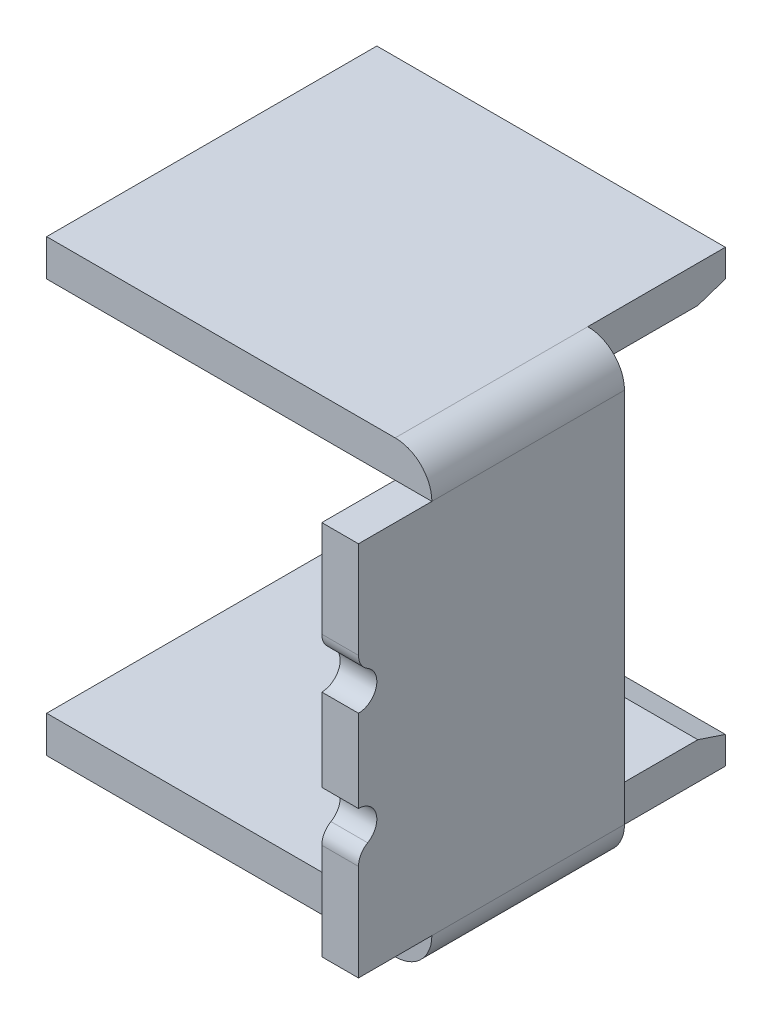
ISO-10303-21;
HEADER;
FILE_DESCRIPTION(('STEP AP214'),'2;1');
FILE_NAME('part.step','',(''),(''),'','','');
FILE_SCHEMA(('AUTOMOTIVE_DESIGN { 1 0 10303 214 1 1 1 1 }'));
ENDSEC;
DATA;
#1=APPLICATION_CONTEXT('core data for automotive mechanical design processes');
#2=APPLICATION_PROTOCOL_DEFINITION('international standard','automotive_design',2000,#1);
#3=PRODUCT_CONTEXT('',#1,'mechanical');
#4=PRODUCT('Part','Part','',(#3));
#5=PRODUCT_RELATED_PRODUCT_CATEGORY('part','',(#4));
#6=PRODUCT_DEFINITION_FORMATION('','',#4);
#7=PRODUCT_DEFINITION_CONTEXT('part definition',#1,'design');
#8=PRODUCT_DEFINITION('design','',#6,#7);
#9=PRODUCT_DEFINITION_SHAPE('','',#8);
#10=(LENGTH_UNIT() NAMED_UNIT(*) SI_UNIT(.MILLI.,.METRE.));
#11=(NAMED_UNIT(*) PLANE_ANGLE_UNIT() SI_UNIT($,.RADIAN.));
#12=(NAMED_UNIT(*) SI_UNIT($,.STERADIAN.) SOLID_ANGLE_UNIT());
#13=UNCERTAINTY_MEASURE_WITH_UNIT(LENGTH_MEASURE(1.E-05),#10,'distance_accuracy_value','');
#14=(GEOMETRIC_REPRESENTATION_CONTEXT(3) GLOBAL_UNCERTAINTY_ASSIGNED_CONTEXT((#13)) GLOBAL_UNIT_ASSIGNED_CONTEXT((#10,
#11,#12)) REPRESENTATION_CONTEXT('',''));
#15=CARTESIAN_POINT('',(0.,0.,0.));
#16=DIRECTION('',(0.,0.,1.));
#17=DIRECTION('',(1.,0.,0.));
#18=AXIS2_PLACEMENT_3D('',#15,#16,#17);
#19=CARTESIAN_POINT('',(2.1,0.2,0.15));
#20=DIRECTION('',(0.,0.948683298050514,-0.316227766016838));
#21=DIRECTION('',(-1.,0.,0.));
#22=AXIS2_PLACEMENT_3D('',#19,#20,#21);
#23=PLANE('',#22);
#24=DIRECTION('',(-1.,0.,0.));
#25=VECTOR('',#24,1.);
#26=CARTESIAN_POINT('',(2.1,0.15,0.));
#27=LINE('',#26,#25);
#28=CARTESIAN_POINT('',(1.9,0.15,0.));
#29=VERTEX_POINT('',#28);
#30=CARTESIAN_POINT('',(0.,0.15,0.));
#31=VERTEX_POINT('',#30);
#32=EDGE_CURVE('E424',#29,#31,#27,.T.);
#33=ORIENTED_EDGE('',*,*,#32,.T.);
#34=DIRECTION('',(0.,-0.316227766016838,-0.948683298050514));
#35=VECTOR('',#34,1.);
#36=CARTESIAN_POINT('',(0.,0.2,0.15));
#37=LINE('',#36,#35);
#38=CARTESIAN_POINT('',(0.,0.2,0.15));
#39=VERTEX_POINT('',#38);
#40=EDGE_CURVE('E21',#39,#31,#37,.T.);
#41=ORIENTED_EDGE('',*,*,#40,.F.);
#42=DIRECTION('',(-1.,0.,0.));
#43=VECTOR('',#42,1.);
#44=CARTESIAN_POINT('',(2.1,0.2,0.15));
#45=LINE('',#44,#43);
#46=CARTESIAN_POINT('',(1.9,0.2,0.15));
#47=VERTEX_POINT('',#46);
#48=EDGE_CURVE('E285',#47,#39,#45,.T.);
#49=ORIENTED_EDGE('',*,*,#48,.F.);
#50=DIRECTION('',(0.,0.316227766016838,0.948683298050514));
#51=VECTOR('',#50,1.);
#52=CARTESIAN_POINT('',(1.9,0.38,0.69));
#53=LINE('',#52,#51);
#54=EDGE_CURVE('E290',#29,#47,#53,.T.);
#55=ORIENTED_EDGE('',*,*,#54,.F.);
#56=EDGE_LOOP('',(#33,#41,#49,#55));
#57=FACE_BOUND('',#56,.T.);
#58=ADVANCED_FACE('F17',(#57),#23,.T.);
#59=CARTESIAN_POINT('',(2.1,2.3,0.));
#60=DIRECTION('',(0.,-0.948683298050514,-0.316227766016838));
#61=DIRECTION('',(0.,0.316227766016838,-0.948683298050514));
#62=AXIS2_PLACEMENT_3D('',#59,#60,#61);
#63=PLANE('',#62);
#64=DIRECTION('',(-1.,0.,0.));
#65=VECTOR('',#64,1.);
#66=CARTESIAN_POINT('',(2.1,2.25,0.15));
#67=LINE('',#66,#65);
#68=CARTESIAN_POINT('',(1.9,2.25,0.15));
#69=VERTEX_POINT('',#68);
#70=CARTESIAN_POINT('',(0.,2.25,0.15));
#71=VERTEX_POINT('',#70);
#72=EDGE_CURVE('E259',#69,#71,#67,.T.);
#73=ORIENTED_EDGE('',*,*,#72,.T.);
#74=DIRECTION('',(0.,-0.316227766016838,0.948683298050514));
#75=VECTOR('',#74,1.);
#76=CARTESIAN_POINT('',(0.,2.3,0.));
#77=LINE('',#76,#75);
#78=CARTESIAN_POINT('',(0.,2.3,0.));
#79=VERTEX_POINT('',#78);
#80=EDGE_CURVE('E246',#79,#71,#77,.T.);
#81=ORIENTED_EDGE('',*,*,#80,.F.);
#82=DIRECTION('',(-1.,0.,0.));
#83=VECTOR('',#82,1.);
#84=CARTESIAN_POINT('',(2.1,2.3,0.));
#85=LINE('',#84,#83);
#86=CARTESIAN_POINT('',(1.9,2.3,0.));
#87=VERTEX_POINT('',#86);
#88=EDGE_CURVE('E307',#87,#79,#85,.T.);
#89=ORIENTED_EDGE('',*,*,#88,.F.);
#90=DIRECTION('',(0.,0.316227766016838,-0.948683298050514));
#91=VECTOR('',#90,1.);
#92=CARTESIAN_POINT('',(1.9,2.315,-0.045));
#93=LINE('',#92,#91);
#94=EDGE_CURVE('E233',#69,#87,#93,.T.);
#95=ORIENTED_EDGE('',*,*,#94,.F.);
#96=EDGE_LOOP('',(#73,#81,#89,#95));
#97=FACE_BOUND('',#96,.T.);
#98=ADVANCED_FACE('F507',(#97),#63,.T.);
#99=CARTESIAN_POINT('',(1.9,2.25,1.8));
#100=DIRECTION('',(0.,1.,0.));
#101=DIRECTION('',(1.,0.,0.));
#102=AXIS2_PLACEMENT_3D('',#99,#100,#101);
#103=PLANE('',#102);
#104=DIRECTION('',(0.,0.,1.));
#105=VECTOR('',#104,1.);
#106=CARTESIAN_POINT('',(2.1,2.25,1.8));
#107=LINE('',#106,#105);
#108=CARTESIAN_POINT('',(2.1,2.25,1.8));
#109=VERTEX_POINT('',#108);
#110=CARTESIAN_POINT('',(2.1,2.25,2.2));
#111=VERTEX_POINT('',#110);
#112=EDGE_CURVE('E298',#109,#111,#107,.T.);
#113=ORIENTED_EDGE('',*,*,#112,.F.);
#114=DIRECTION('',(1.,0.,0.));
#115=VECTOR('',#114,1.);
#116=CARTESIAN_POINT('',(1.9,2.25,1.8));
#117=LINE('',#116,#115);
#118=CARTESIAN_POINT('',(1.9,2.25,1.8));
#119=VERTEX_POINT('',#118);
#120=EDGE_CURVE('E191',#119,#109,#117,.T.);
#121=ORIENTED_EDGE('',*,*,#120,.F.);
#122=DIRECTION('',(0.,0.,1.));
#123=VECTOR('',#122,1.);
#124=CARTESIAN_POINT('',(1.9,2.25,1.8));
#125=LINE('',#124,#123);
#126=CARTESIAN_POINT('',(1.9,2.25,2.2));
#127=VERTEX_POINT('',#126);
#128=EDGE_CURVE('E324',#119,#127,#125,.T.);
#129=ORIENTED_EDGE('',*,*,#128,.T.);
#130=DIRECTION('',(1.,0.,0.));
#131=VECTOR('',#130,1.);
#132=CARTESIAN_POINT('',(1.9,2.25,2.2));
#133=LINE('',#132,#131);
#134=EDGE_CURVE('E42',#127,#111,#133,.T.);
#135=ORIENTED_EDGE('',*,*,#134,.T.);
#136=EDGE_LOOP('',(#113,#121,#129,#135));
#137=FACE_BOUND('',#136,.T.);
#138=ADVANCED_FACE('F581',(#137),#103,.T.);
#139=CARTESIAN_POINT('',(1.9,0.2,2.2));
#140=DIRECTION('',(0.,-1.,0.));
#141=DIRECTION('',(0.,0.,-1.));
#142=AXIS2_PLACEMENT_3D('',#139,#140,#141);
#143=PLANE('',#142);
#144=DIRECTION('',(0.,0.,-1.));
#145=VECTOR('',#144,1.);
#146=CARTESIAN_POINT('',(2.1,0.2,2.2));
#147=LINE('',#146,#145);
#148=CARTESIAN_POINT('',(2.1,0.2,2.2));
#149=VERTEX_POINT('',#148);
#150=CARTESIAN_POINT('',(2.1,0.2,1.8));
#151=VERTEX_POINT('',#150);
#152=EDGE_CURVE('E268',#149,#151,#147,.T.);
#153=ORIENTED_EDGE('',*,*,#152,.F.);
#154=DIRECTION('',(1.,0.,0.));
#155=VECTOR('',#154,1.);
#156=CARTESIAN_POINT('',(1.9,0.2,2.2));
#157=LINE('',#156,#155);
#158=CARTESIAN_POINT('',(1.9,0.2,2.2));
#159=VERTEX_POINT('',#158);
#160=EDGE_CURVE('E11',#159,#149,#157,.T.);
#161=ORIENTED_EDGE('',*,*,#160,.F.);
#162=DIRECTION('',(0.,0.,-1.));
#163=VECTOR('',#162,1.);
#164=CARTESIAN_POINT('',(1.9,0.2,2.2));
#165=LINE('',#164,#163);
#166=CARTESIAN_POINT('',(1.9,0.2,1.8));
#167=VERTEX_POINT('',#166);
#168=EDGE_CURVE('E318',#159,#167,#165,.T.);
#169=ORIENTED_EDGE('',*,*,#168,.T.);
#170=DIRECTION('',(1.,0.,0.));
#171=VECTOR('',#170,1.);
#172=CARTESIAN_POINT('',(1.9,0.2,1.8));
#173=LINE('',#172,#171);
#174=EDGE_CURVE('E323',#167,#151,#173,.T.);
#175=ORIENTED_EDGE('',*,*,#174,.T.);
#176=EDGE_LOOP('',(#153,#161,#169,#175));
#177=FACE_BOUND('',#176,.T.);
#178=ADVANCED_FACE('F541',(#177),#143,.T.);
#179=CARTESIAN_POINT('',(1.9,0.726794919243,2.2));
#180=DIRECTION('',(0.,0.,1.));
#181=DIRECTION('',(1.,0.,0.));
#182=AXIS2_PLACEMENT_3D('',#179,#180,#181);
#183=PLANE('',#182);
#184=DIRECTION('',(0.,-1.,0.));
#185=VECTOR('',#184,1.);
#186=CARTESIAN_POINT('',(2.1,0.726794919243,2.2));
#187=LINE('',#186,#185);
#188=CARTESIAN_POINT('',(2.1,0.726794919243,2.2));
#189=VERTEX_POINT('',#188);
#190=EDGE_CURVE('E306',#189,#149,#187,.T.);
#191=ORIENTED_EDGE('',*,*,#190,.F.);
#192=DIRECTION('',(1.,0.,0.));
#193=VECTOR('',#192,1.);
#194=CARTESIAN_POINT('',(1.9,0.726794919243,2.2));
#195=LINE('',#194,#193);
#196=CARTESIAN_POINT('',(1.9,0.726794919243,2.2));
#197=VERTEX_POINT('',#196);
#198=EDGE_CURVE('E28',#197,#189,#195,.T.);
#199=ORIENTED_EDGE('',*,*,#198,.F.);
#200=DIRECTION('',(0.,-1.,0.));
#201=VECTOR('',#200,1.);
#202=CARTESIAN_POINT('',(1.9,0.726794919243,2.2));
#203=LINE('',#202,#201);
#204=EDGE_CURVE('E412',#197,#159,#203,.T.);
#205=ORIENTED_EDGE('',*,*,#204,.T.);
#206=ORIENTED_EDGE('',*,*,#160,.T.);
#207=EDGE_LOOP('',(#191,#199,#205,#206));
#208=FACE_BOUND('',#207,.T.);
#209=ADVANCED_FACE('F587',(#208),#183,.T.);
#210=CARTESIAN_POINT('',(1.9,0.726794919243,2.1));
#211=DIRECTION('',(1.,0.,0.));
#212=DIRECTION('',(0.,0.,-1.));
#213=AXIS2_PLACEMENT_3D('',#210,#211,#212);
#214=CYLINDRICAL_SURFACE('',#213,0.1);
#215=CARTESIAN_POINT('',(2.1,0.726794919243,2.1));
#216=DIRECTION('',(1.,0.,0.));
#217=DIRECTION('',(0.,0.,-1.));
#218=AXIS2_PLACEMENT_3D('',#215,#216,#217);
#219=CIRCLE('',#218,0.1);
#220=CARTESIAN_POINT('',(2.1,0.813397461903,2.149999996049));
#221=VERTEX_POINT('',#220);
#222=EDGE_CURVE('E228',#221,#189,#219,.T.);
#223=ORIENTED_EDGE('',*,*,#222,.F.);
#224=DIRECTION('',(1.,0.,0.));
#225=VECTOR('',#224,1.);
#226=CARTESIAN_POINT('',(1.9,0.813397461903,2.149999996049));
#227=LINE('',#226,#225);
#228=CARTESIAN_POINT('',(1.9,0.813397461903,2.149999996049));
#229=VERTEX_POINT('',#228);
#230=EDGE_CURVE('E240',#229,#221,#227,.T.);
#231=ORIENTED_EDGE('',*,*,#230,.F.);
#232=CARTESIAN_POINT('',(1.9,0.726794919243,2.1));
#233=DIRECTION('',(1.,0.,0.));
#234=DIRECTION('',(0.,0.,-1.));
#235=AXIS2_PLACEMENT_3D('',#232,#233,#234);
#236=CIRCLE('',#235,0.1);
#237=EDGE_CURVE('E370',#229,#197,#236,.T.);
#238=ORIENTED_EDGE('',*,*,#237,.T.);
#239=ORIENTED_EDGE('',*,*,#198,.T.);
#240=EDGE_LOOP('',(#223,#231,#238,#239));
#241=FACE_BOUND('',#240,.T.);
#242=ADVANCED_FACE('F601',(#241),#214,.T.);
#243=CARTESIAN_POINT('',(1.9,0.9,2.2));
#244=DIRECTION('',(1.,0.,0.));
#245=DIRECTION('',(0.,0.,-1.));
#246=AXIS2_PLACEMENT_3D('',#243,#244,#245);
#247=CYLINDRICAL_SURFACE('',#246,0.1);
#248=CARTESIAN_POINT('',(2.1,0.9,2.2));
#249=DIRECTION('',(1.,0.,0.));
#250=DIRECTION('',(0.,0.,-1.));
#251=AXIS2_PLACEMENT_3D('',#248,#249,#250);
#252=CIRCLE('',#251,0.1);
#253=CARTESIAN_POINT('',(2.1,1.,2.2));
#254=VERTEX_POINT('',#253);
#255=EDGE_CURVE('E218',#221,#254,#252,.T.);
#256=ORIENTED_EDGE('',*,*,#255,.T.);
#257=DIRECTION('',(1.,0.,0.));
#258=VECTOR('',#257,1.);
#259=CARTESIAN_POINT('',(1.9,1.,2.2));
#260=LINE('',#259,#258);
#261=CARTESIAN_POINT('',(1.9,1.,2.2));
#262=VERTEX_POINT('',#261);
#263=EDGE_CURVE('E237',#262,#254,#260,.T.);
#264=ORIENTED_EDGE('',*,*,#263,.F.);
#265=CARTESIAN_POINT('',(1.9,0.9,2.2));
#266=DIRECTION('',(1.,0.,0.));
#267=DIRECTION('',(0.,0.,-1.));
#268=AXIS2_PLACEMENT_3D('',#265,#266,#267);
#269=CIRCLE('',#268,0.1);
#270=EDGE_CURVE('E265',#229,#262,#269,.T.);
#271=ORIENTED_EDGE('',*,*,#270,.F.);
#272=ORIENTED_EDGE('',*,*,#230,.T.);
#273=EDGE_LOOP('',(#256,#264,#271,#272));
#274=FACE_BOUND('',#273,.T.);
#275=ADVANCED_FACE('F612',(#274),#247,.F.);
#276=CARTESIAN_POINT('',(1.9,1.45,2.2));
#277=DIRECTION('',(0.,0.,1.));
#278=DIRECTION('',(1.,0.,0.));
#279=AXIS2_PLACEMENT_3D('',#276,#277,#278);
#280=PLANE('',#279);
#281=DIRECTION('',(0.,-1.,0.));
#282=VECTOR('',#281,1.);
#283=CARTESIAN_POINT('',(2.1,1.45,2.2));
#284=LINE('',#283,#282);
#285=CARTESIAN_POINT('',(2.1,1.45,2.2));
#286=VERTEX_POINT('',#285);
#287=EDGE_CURVE('E210',#286,#254,#284,.T.);
#288=ORIENTED_EDGE('',*,*,#287,.F.);
#289=DIRECTION('',(1.,0.,0.));
#290=VECTOR('',#289,1.);
#291=CARTESIAN_POINT('',(1.9,1.45,2.2));
#292=LINE('',#291,#290);
#293=CARTESIAN_POINT('',(1.9,1.45,2.2));
#294=VERTEX_POINT('',#293);
#295=EDGE_CURVE('E241',#294,#286,#292,.T.);
#296=ORIENTED_EDGE('',*,*,#295,.F.);
#297=DIRECTION('',(0.,-1.,0.));
#298=VECTOR('',#297,1.);
#299=CARTESIAN_POINT('',(1.9,1.45,2.2));
#300=LINE('',#299,#298);
#301=EDGE_CURVE('E260',#294,#262,#300,.T.);
#302=ORIENTED_EDGE('',*,*,#301,.T.);
#303=ORIENTED_EDGE('',*,*,#263,.T.);
#304=EDGE_LOOP('',(#288,#296,#302,#303));
#305=FACE_BOUND('',#304,.T.);
#306=ADVANCED_FACE('F619',(#305),#280,.T.);
#307=CARTESIAN_POINT('',(1.9,1.55,2.2));
#308=DIRECTION('',(1.,0.,0.));
#309=DIRECTION('',(0.,0.,-1.));
#310=AXIS2_PLACEMENT_3D('',#307,#308,#309);
#311=CYLINDRICAL_SURFACE('',#310,0.1);
#312=CARTESIAN_POINT('',(2.1,1.55,2.2));
#313=DIRECTION('',(1.,0.,0.));
#314=DIRECTION('',(0.,0.,-1.));
#315=AXIS2_PLACEMENT_3D('',#312,#313,#314);
#316=CIRCLE('',#315,0.1);
#317=CARTESIAN_POINT('',(2.1,1.636602538097,2.149999996049));
#318=VERTEX_POINT('',#317);
#319=EDGE_CURVE('E206',#286,#318,#316,.T.);
#320=ORIENTED_EDGE('',*,*,#319,.T.);
#321=DIRECTION('',(1.,0.,0.));
#322=VECTOR('',#321,1.);
#323=CARTESIAN_POINT('',(1.9,1.636602538097,2.149999996049));
#324=LINE('',#323,#322);
#325=CARTESIAN_POINT('',(1.9,1.636602538097,2.149999996049));
#326=VERTEX_POINT('',#325);
#327=EDGE_CURVE('E250',#326,#318,#324,.T.);
#328=ORIENTED_EDGE('',*,*,#327,.F.);
#329=CARTESIAN_POINT('',(1.9,1.55,2.2));
#330=DIRECTION('',(1.,0.,0.));
#331=DIRECTION('',(0.,0.,-1.));
#332=AXIS2_PLACEMENT_3D('',#329,#330,#331);
#333=CIRCLE('',#332,0.1);
#334=EDGE_CURVE('E264',#294,#326,#333,.T.);
#335=ORIENTED_EDGE('',*,*,#334,.F.);
#336=ORIENTED_EDGE('',*,*,#295,.T.);
#337=EDGE_LOOP('',(#320,#328,#335,#336));
#338=FACE_BOUND('',#337,.T.);
#339=ADVANCED_FACE('F615',(#338),#311,.F.);
#340=CARTESIAN_POINT('',(1.9,1.723205080757,2.1));
#341=DIRECTION('',(1.,0.,0.));
#342=DIRECTION('',(0.,0.,-1.));
#343=AXIS2_PLACEMENT_3D('',#340,#341,#342);
#344=CYLINDRICAL_SURFACE('',#343,0.1);
#345=CARTESIAN_POINT('',(2.1,1.723205080757,2.1));
#346=DIRECTION('',(1.,0.,0.));
#347=DIRECTION('',(0.,0.,-1.));
#348=AXIS2_PLACEMENT_3D('',#345,#346,#347);
#349=CIRCLE('',#348,0.1);
#350=CARTESIAN_POINT('',(2.1,1.723205080757,2.2));
#351=VERTEX_POINT('',#350);
#352=EDGE_CURVE('E204',#351,#318,#349,.T.);
#353=ORIENTED_EDGE('',*,*,#352,.F.);
#354=DIRECTION('',(1.,0.,0.));
#355=VECTOR('',#354,1.);
#356=CARTESIAN_POINT('',(1.9,1.723205080757,2.2));
#357=LINE('',#356,#355);
#358=CARTESIAN_POINT('',(1.9,1.723205080757,2.2));
#359=VERTEX_POINT('',#358);
#360=EDGE_CURVE('E253',#359,#351,#357,.T.);
#361=ORIENTED_EDGE('',*,*,#360,.F.);
#362=CARTESIAN_POINT('',(1.9,1.723205080757,2.1));
#363=DIRECTION('',(1.,0.,0.));
#364=DIRECTION('',(0.,0.,-1.));
#365=AXIS2_PLACEMENT_3D('',#362,#363,#364);
#366=CIRCLE('',#365,0.1);
#367=EDGE_CURVE('E341',#359,#326,#366,.T.);
#368=ORIENTED_EDGE('',*,*,#367,.T.);
#369=ORIENTED_EDGE('',*,*,#327,.T.);
#370=EDGE_LOOP('',(#353,#361,#368,#369));
#371=FACE_BOUND('',#370,.T.);
#372=ADVANCED_FACE('F618',(#371),#344,.T.);
#373=CARTESIAN_POINT('',(1.9,2.25,2.2));
#374=DIRECTION('',(0.,0.,1.));
#375=DIRECTION('',(1.,0.,0.));
#376=AXIS2_PLACEMENT_3D('',#373,#374,#375);
#377=PLANE('',#376);
#378=DIRECTION('',(0.,-1.,0.));
#379=VECTOR('',#378,1.);
#380=CARTESIAN_POINT('',(2.1,2.25,2.2));
#381=LINE('',#380,#379);
#382=EDGE_CURVE('E207',#111,#351,#381,.T.);
#383=ORIENTED_EDGE('',*,*,#382,.F.);
#384=ORIENTED_EDGE('',*,*,#134,.F.);
#385=DIRECTION('',(0.,-1.,0.));
#386=VECTOR('',#385,1.);
#387=CARTESIAN_POINT('',(1.9,2.25,2.2));
#388=LINE('',#387,#386);
#389=EDGE_CURVE('E333',#127,#359,#388,.T.);
#390=ORIENTED_EDGE('',*,*,#389,.T.);
#391=ORIENTED_EDGE('',*,*,#360,.T.);
#392=EDGE_LOOP('',(#383,#384,#390,#391));
#393=FACE_BOUND('',#392,.T.);
#394=ADVANCED_FACE('F626',(#393),#377,.T.);
#395=CARTESIAN_POINT('',(1.9,2.45,0.75));
#396=DIRECTION('',(0.,0.,-1.));
#397=DIRECTION('',(0.,-1.,0.));
#398=AXIS2_PLACEMENT_3D('',#395,#396,#397);
#399=PLANE('',#398);
#400=CARTESIAN_POINT('',(1.9,0.2,0.75));
#401=DIRECTION('',(0.,0.,-1.));
#402=DIRECTION('',(-1.,0.,0.));
#403=AXIS2_PLACEMENT_3D('',#400,#401,#402);
#404=CIRCLE('',#403,0.2);
#405=CARTESIAN_POINT('',(2.1,0.2,0.75));
#406=VERTEX_POINT('',#405);
#407=CARTESIAN_POINT('',(1.9,0.,0.75));
#408=VERTEX_POINT('',#407);
#409=EDGE_CURVE('E187',#406,#408,#404,.T.);
#410=ORIENTED_EDGE('',*,*,#409,.T.);
#411=DIRECTION('',(0.,-1.,0.));
#412=VECTOR('',#411,1.);
#413=CARTESIAN_POINT('',(1.9,2.45,0.75));
#414=LINE('',#413,#412);
#415=CARTESIAN_POINT('',(1.9,0.2,0.75));
#416=VERTEX_POINT('',#415);
#417=EDGE_CURVE('E286',#416,#408,#414,.T.);
#418=ORIENTED_EDGE('',*,*,#417,.F.);
#419=DIRECTION('',(0.,-1.,0.));
#420=VECTOR('',#419,1.);
#421=CARTESIAN_POINT('',(1.9,2.45,0.75));
#422=LINE('',#421,#420);
#423=CARTESIAN_POINT('',(1.9,2.25,0.75));
#424=VERTEX_POINT('',#423);
#425=EDGE_CURVE('E175',#424,#416,#422,.T.);
#426=ORIENTED_EDGE('',*,*,#425,.F.);
#427=DIRECTION('',(0.,-1.,0.));
#428=VECTOR('',#427,1.);
#429=CARTESIAN_POINT('',(1.9,2.45,0.75));
#430=LINE('',#429,#428);
#431=CARTESIAN_POINT('',(1.9,2.45,0.75));
#432=VERTEX_POINT('',#431);
#433=EDGE_CURVE('E198',#432,#424,#430,.T.);
#434=ORIENTED_EDGE('',*,*,#433,.F.);
#435=CARTESIAN_POINT('',(1.9,2.25,0.75));
#436=DIRECTION('',(0.,0.,-1.));
#437=DIRECTION('',(-1.,0.,0.));
#438=AXIS2_PLACEMENT_3D('',#435,#436,#437);
#439=CIRCLE('',#438,0.2);
#440=CARTESIAN_POINT('',(2.1,2.25,0.75));
#441=VERTEX_POINT('',#440);
#442=EDGE_CURVE('E170',#432,#441,#439,.T.);
#443=ORIENTED_EDGE('',*,*,#442,.T.);
#444=DIRECTION('',(0.,-1.,0.));
#445=VECTOR('',#444,1.);
#446=CARTESIAN_POINT('',(2.1,2.45,0.75));
#447=LINE('',#446,#445);
#448=EDGE_CURVE('E232',#441,#406,#447,.T.);
#449=ORIENTED_EDGE('',*,*,#448,.T.);
#450=EDGE_LOOP('',(#410,#418,#426,#434,#443,#449));
#451=FACE_BOUND('',#450,.T.);
#452=ADVANCED_FACE('F510',(#451),#399,.T.);
#453=CARTESIAN_POINT('',(1.9,0.2,1.8));
#454=DIRECTION('',(0.,0.,1.));
#455=DIRECTION('',(1.,0.,0.));
#456=AXIS2_PLACEMENT_3D('',#453,#454,#455);
#457=PLANE('',#456);
#458=ORIENTED_EDGE('',*,*,#174,.F.);
#459=DIRECTION('',(-1.,0.,0.));
#460=VECTOR('',#459,1.);
#461=CARTESIAN_POINT('',(1.9,0.2,1.8));
#462=LINE('',#461,#460);
#463=CARTESIAN_POINT('',(0.,0.2,1.8));
#464=VERTEX_POINT('',#463);
#465=EDGE_CURVE('E280',#167,#464,#462,.T.);
#466=ORIENTED_EDGE('',*,*,#465,.T.);
#467=DIRECTION('',(0.,-1.,0.));
#468=VECTOR('',#467,1.);
#469=CARTESIAN_POINT('',(0.,0.2,1.8));
#470=LINE('',#469,#468);
#471=CARTESIAN_POINT('',(0.,0.,1.8));
#472=VERTEX_POINT('',#471);
#473=EDGE_CURVE('E242',#464,#472,#470,.T.);
#474=ORIENTED_EDGE('',*,*,#473,.T.);
#475=DIRECTION('',(1.,0.,0.));
#476=VECTOR('',#475,1.);
#477=CARTESIAN_POINT('',(0.,0.,1.8));
#478=LINE('',#477,#476);
#479=CARTESIAN_POINT('',(1.9,0.,1.8));
#480=VERTEX_POINT('',#479);
#481=EDGE_CURVE('E321',#472,#480,#478,.T.);
#482=ORIENTED_EDGE('',*,*,#481,.T.);
#483=CARTESIAN_POINT('',(1.9,0.2,1.8));
#484=DIRECTION('',(0.,0.,1.));
#485=DIRECTION('',(1.,0.,0.));
#486=AXIS2_PLACEMENT_3D('',#483,#484,#485);
#487=CIRCLE('',#486,0.2);
#488=EDGE_CURVE('E394',#480,#151,#487,.T.);
#489=ORIENTED_EDGE('',*,*,#488,.T.);
#490=EDGE_LOOP('',(#458,#466,#474,#482,#489));
#491=FACE_BOUND('',#490,.T.);
#492=ADVANCED_FACE('F547',(#491),#457,.T.);
#493=CARTESIAN_POINT('',(1.9,2.45,1.8));
#494=DIRECTION('',(0.,-1.,0.));
#495=DIRECTION('',(0.,0.,-1.));
#496=AXIS2_PLACEMENT_3D('',#493,#494,#495);
#497=PLANE('',#496);
#498=DIRECTION('',(-1.,0.,0.));
#499=VECTOR('',#498,1.);
#500=CARTESIAN_POINT('',(1.9,2.45,0.));
#501=LINE('',#500,#499);
#502=CARTESIAN_POINT('',(1.9,2.45,0.));
#503=VERTEX_POINT('',#502);
#504=CARTESIAN_POINT('',(0.,2.45,0.));
#505=VERTEX_POINT('',#504);
#506=EDGE_CURVE('E366',#503,#505,#501,.T.);
#507=ORIENTED_EDGE('',*,*,#506,.T.);
#508=DIRECTION('',(0.,0.,-1.));
#509=VECTOR('',#508,1.);
#510=CARTESIAN_POINT('',(0.,2.45,1.8));
#511=LINE('',#510,#509);
#512=CARTESIAN_POINT('',(0.,2.45,1.8));
#513=VERTEX_POINT('',#512);
#514=EDGE_CURVE('E182',#513,#505,#511,.T.);
#515=ORIENTED_EDGE('',*,*,#514,.F.);
#516=DIRECTION('',(-1.,0.,0.));
#517=VECTOR('',#516,1.);
#518=CARTESIAN_POINT('',(1.9,2.45,1.8));
#519=LINE('',#518,#517);
#520=CARTESIAN_POINT('',(1.9,2.45,1.8));
#521=VERTEX_POINT('',#520);
#522=EDGE_CURVE('E178',#521,#513,#519,.T.);
#523=ORIENTED_EDGE('',*,*,#522,.F.);
#524=DIRECTION('',(0.,0.,-1.));
#525=VECTOR('',#524,1.);
#526=CARTESIAN_POINT('',(1.9,2.45,1.8));
#527=LINE('',#526,#525);
#528=EDGE_CURVE('E162',#521,#432,#527,.T.);
#529=ORIENTED_EDGE('',*,*,#528,.T.);
#530=DIRECTION('',(0.,0.,1.));
#531=VECTOR('',#530,1.);
#532=CARTESIAN_POINT('',(1.9,2.45,0.));
#533=LINE('',#532,#531);
#534=EDGE_CURVE('E234',#503,#432,#533,.T.);
#535=ORIENTED_EDGE('',*,*,#534,.F.);
#536=EDGE_LOOP('',(#507,#515,#523,#529,#535));
#537=FACE_BOUND('',#536,.T.);
#538=ADVANCED_FACE('F180',(#537),#497,.F.);
#539=CARTESIAN_POINT('',(0.,0.,1.8));
#540=DIRECTION('',(0.,1.,0.));
#541=DIRECTION('',(1.,0.,0.));
#542=AXIS2_PLACEMENT_3D('',#539,#540,#541);
#543=PLANE('',#542);
#544=DIRECTION('',(1.,0.,0.));
#545=VECTOR('',#544,1.);
#546=CARTESIAN_POINT('',(0.,0.,0.));
#547=LINE('',#546,#545);
#548=CARTESIAN_POINT('',(0.,0.,0.));
#549=VERTEX_POINT('',#548);
#550=CARTESIAN_POINT('',(1.9,0.,0.));
#551=VERTEX_POINT('',#550);
#552=EDGE_CURVE('E356',#549,#551,#547,.T.);
#553=ORIENTED_EDGE('',*,*,#552,.T.);
#554=DIRECTION('',(0.,0.,1.));
#555=VECTOR('',#554,1.);
#556=CARTESIAN_POINT('',(1.9,0.,0.));
#557=LINE('',#556,#555);
#558=EDGE_CURVE('E235',#551,#408,#557,.T.);
#559=ORIENTED_EDGE('',*,*,#558,.T.);
#560=DIRECTION('',(0.,0.,-1.));
#561=VECTOR('',#560,1.);
#562=CARTESIAN_POINT('',(1.9,0.,1.8));
#563=LINE('',#562,#561);
#564=EDGE_CURVE('E397',#480,#408,#563,.T.);
#565=ORIENTED_EDGE('',*,*,#564,.F.);
#566=ORIENTED_EDGE('',*,*,#481,.F.);
#567=DIRECTION('',(0.,0.,-1.));
#568=VECTOR('',#567,1.);
#569=CARTESIAN_POINT('',(0.,0.,1.8));
#570=LINE('',#569,#568);
#571=EDGE_CURVE('E247',#472,#549,#570,.T.);
#572=ORIENTED_EDGE('',*,*,#571,.T.);
#573=EDGE_LOOP('',(#553,#559,#565,#566,#572));
#574=FACE_BOUND('',#573,.T.);
#575=ADVANCED_FACE('F551',(#574),#543,.F.);
#576=CARTESIAN_POINT('',(1.9,2.25,1.8));
#577=DIRECTION('',(1.,0.,0.));
#578=DIRECTION('',(0.,1.,0.));
#579=AXIS2_PLACEMENT_3D('',#576,#577,#578);
#580=PLANE('',#579);
#581=ORIENTED_EDGE('',*,*,#425,.T.);
#582=DIRECTION('',(0.,0.,-1.));
#583=VECTOR('',#582,1.);
#584=CARTESIAN_POINT('',(1.9,0.2,1.8));
#585=LINE('',#584,#583);
#586=EDGE_CURVE('E275',#167,#416,#585,.T.);
#587=ORIENTED_EDGE('',*,*,#586,.F.);
#588=ORIENTED_EDGE('',*,*,#168,.F.);
#589=ORIENTED_EDGE('',*,*,#204,.F.);
#590=ORIENTED_EDGE('',*,*,#237,.F.);
#591=ORIENTED_EDGE('',*,*,#270,.T.);
#592=ORIENTED_EDGE('',*,*,#301,.F.);
#593=ORIENTED_EDGE('',*,*,#334,.T.);
#594=ORIENTED_EDGE('',*,*,#367,.F.);
#595=ORIENTED_EDGE('',*,*,#389,.F.);
#596=ORIENTED_EDGE('',*,*,#128,.F.);
#597=DIRECTION('',(0.,0.,-1.));
#598=VECTOR('',#597,1.);
#599=CARTESIAN_POINT('',(1.9,2.25,1.8));
#600=LINE('',#599,#598);
#601=EDGE_CURVE('E258',#119,#424,#600,.T.);
#602=ORIENTED_EDGE('',*,*,#601,.T.);
#603=EDGE_LOOP('',(#581,#587,#588,#589,#590,#591,#592,#593,#594,#595,#596,#602));
#604=FACE_BOUND('',#603,.T.);
#605=ADVANCED_FACE('F439',(#604),#580,.F.);
#606=CARTESIAN_POINT('',(1.9,2.25,1.8));
#607=DIRECTION('',(0.,0.,-1.));
#608=DIRECTION('',(-1.,0.,0.));
#609=AXIS2_PLACEMENT_3D('',#606,#607,#608);
#610=CYLINDRICAL_SURFACE('',#609,0.2);
#611=ORIENTED_EDGE('',*,*,#442,.F.);
#612=ORIENTED_EDGE('',*,*,#528,.F.);
#613=CARTESIAN_POINT('',(1.9,2.25,1.8));
#614=DIRECTION('',(0.,0.,1.));
#615=DIRECTION('',(1.,0.,0.));
#616=AXIS2_PLACEMENT_3D('',#613,#614,#615);
#617=CIRCLE('',#616,0.2);
#618=EDGE_CURVE('E167',#109,#521,#617,.T.);
#619=ORIENTED_EDGE('',*,*,#618,.F.);
#620=DIRECTION('',(0.,0.,-1.));
#621=VECTOR('',#620,1.);
#622=CARTESIAN_POINT('',(2.1,2.25,1.8));
#623=LINE('',#622,#621);
#624=EDGE_CURVE('E302',#109,#441,#623,.T.);
#625=ORIENTED_EDGE('',*,*,#624,.T.);
#626=EDGE_LOOP('',(#611,#612,#619,#625));
#627=FACE_BOUND('',#626,.T.);
#628=ADVANCED_FACE('F164',(#627),#610,.T.);
#629=CARTESIAN_POINT('',(2.1,0.2,1.8));
#630=DIRECTION('',(-1.,0.,0.));
#631=DIRECTION('',(0.,0.,1.));
#632=AXIS2_PLACEMENT_3D('',#629,#630,#631);
#633=PLANE('',#632);
#634=ORIENTED_EDGE('',*,*,#448,.F.);
#635=ORIENTED_EDGE('',*,*,#624,.F.);
#636=ORIENTED_EDGE('',*,*,#112,.T.);
#637=ORIENTED_EDGE('',*,*,#382,.T.);
#638=ORIENTED_EDGE('',*,*,#352,.T.);
#639=ORIENTED_EDGE('',*,*,#319,.F.);
#640=ORIENTED_EDGE('',*,*,#287,.T.);
#641=ORIENTED_EDGE('',*,*,#255,.F.);
#642=ORIENTED_EDGE('',*,*,#222,.T.);
#643=ORIENTED_EDGE('',*,*,#190,.T.);
#644=ORIENTED_EDGE('',*,*,#152,.T.);
#645=DIRECTION('',(0.,0.,-1.));
#646=VECTOR('',#645,1.);
#647=CARTESIAN_POINT('',(2.1,0.2,1.8));
#648=LINE('',#647,#646);
#649=EDGE_CURVE('E297',#151,#406,#648,.T.);
#650=ORIENTED_EDGE('',*,*,#649,.T.);
#651=EDGE_LOOP('',(#634,#635,#636,#637,#638,#639,#640,#641,#642,#643,#644,#650));
#652=FACE_BOUND('',#651,.T.);
#653=ADVANCED_FACE('F513',(#652),#633,.F.);
#654=CARTESIAN_POINT('',(1.9,0.2,1.8));
#655=DIRECTION('',(0.,0.,-1.));
#656=DIRECTION('',(-1.,0.,0.));
#657=AXIS2_PLACEMENT_3D('',#654,#655,#656);
#658=CYLINDRICAL_SURFACE('',#657,0.2);
#659=ORIENTED_EDGE('',*,*,#409,.F.);
#660=ORIENTED_EDGE('',*,*,#649,.F.);
#661=ORIENTED_EDGE('',*,*,#488,.F.);
#662=ORIENTED_EDGE('',*,*,#564,.T.);
#663=EDGE_LOOP('',(#659,#660,#661,#662));
#664=FACE_BOUND('',#663,.T.);
#665=ADVANCED_FACE('F549',(#664),#658,.T.);
#666=CARTESIAN_POINT('',(1.9,0.2,1.8));
#667=DIRECTION('',(0.,0.,1.));
#668=DIRECTION('',(1.,0.,0.));
#669=AXIS2_PLACEMENT_3D('',#666,#667,#668);
#670=PLANE('',#669);
#671=DIRECTION('',(1.,0.,0.));
#672=VECTOR('',#671,1.);
#673=CARTESIAN_POINT('',(0.,2.25,1.8));
#674=LINE('',#673,#672);
#675=CARTESIAN_POINT('',(0.,2.25,1.8));
#676=VERTEX_POINT('',#675);
#677=EDGE_CURVE('E348',#676,#119,#674,.T.);
#678=ORIENTED_EDGE('',*,*,#677,.T.);
#679=ORIENTED_EDGE('',*,*,#120,.T.);
#680=ORIENTED_EDGE('',*,*,#618,.T.);
#681=ORIENTED_EDGE('',*,*,#522,.T.);
#682=DIRECTION('',(0.,-1.,0.));
#683=VECTOR('',#682,1.);
#684=CARTESIAN_POINT('',(0.,2.45,1.8));
#685=LINE('',#684,#683);
#686=EDGE_CURVE('E269',#513,#676,#685,.T.);
#687=ORIENTED_EDGE('',*,*,#686,.T.);
#688=EDGE_LOOP('',(#678,#679,#680,#681,#687));
#689=FACE_BOUND('',#688,.T.);
#690=ADVANCED_FACE('F19',(#689),#670,.T.);
#691=CARTESIAN_POINT('',(1.9,2.45,0.));
#692=DIRECTION('',(1.,0.,0.));
#693=DIRECTION('',(0.,1.,0.));
#694=AXIS2_PLACEMENT_3D('',#691,#692,#693);
#695=PLANE('',#694);
#696=DIRECTION('',(0.,0.,-1.));
#697=VECTOR('',#696,1.);
#698=CARTESIAN_POINT('',(1.9,2.25,1.8));
#699=LINE('',#698,#697);
#700=EDGE_CURVE('E254',#424,#69,#699,.T.);
#701=ORIENTED_EDGE('',*,*,#700,.T.);
#702=ORIENTED_EDGE('',*,*,#94,.T.);
#703=DIRECTION('',(0.,-1.,0.));
#704=VECTOR('',#703,1.);
#705=CARTESIAN_POINT('',(1.9,2.45,0.));
#706=LINE('',#705,#704);
#707=EDGE_CURVE('E390',#503,#87,#706,.T.);
#708=ORIENTED_EDGE('',*,*,#707,.F.);
#709=ORIENTED_EDGE('',*,*,#534,.T.);
#710=ORIENTED_EDGE('',*,*,#433,.T.);
#711=EDGE_LOOP('',(#701,#702,#708,#709,#710));
#712=FACE_BOUND('',#711,.T.);
#713=ADVANCED_FACE('F509',(#712),#695,.T.);
#714=CARTESIAN_POINT('',(1.9,2.45,0.));
#715=DIRECTION('',(1.,0.,0.));
#716=DIRECTION('',(0.,1.,0.));
#717=AXIS2_PLACEMENT_3D('',#714,#715,#716);
#718=PLANE('',#717);
#719=DIRECTION('',(0.,1.,0.));
#720=VECTOR('',#719,1.);
#721=CARTESIAN_POINT('',(1.9,0.2,0.));
#722=LINE('',#721,#720);
#723=EDGE_CURVE('E360',#551,#29,#722,.T.);
#724=ORIENTED_EDGE('',*,*,#723,.T.);
#725=ORIENTED_EDGE('',*,*,#54,.T.);
#726=DIRECTION('',(0.,0.,1.));
#727=VECTOR('',#726,1.);
#728=CARTESIAN_POINT('',(1.9,0.2,1.8));
#729=LINE('',#728,#727);
#730=EDGE_CURVE('E279',#47,#416,#729,.T.);
#731=ORIENTED_EDGE('',*,*,#730,.T.);
#732=ORIENTED_EDGE('',*,*,#417,.T.);
#733=ORIENTED_EDGE('',*,*,#558,.F.);
#734=EDGE_LOOP('',(#724,#725,#731,#732,#733));
#735=FACE_BOUND('',#734,.T.);
#736=ADVANCED_FACE('F555',(#735),#718,.T.);
#737=CARTESIAN_POINT('',(0.,2.25,1.8));
#738=DIRECTION('',(0.,1.,0.));
#739=DIRECTION('',(1.,0.,0.));
#740=AXIS2_PLACEMENT_3D('',#737,#738,#739);
#741=PLANE('',#740);
#742=ORIENTED_EDGE('',*,*,#72,.F.);
#743=ORIENTED_EDGE('',*,*,#700,.F.);
#744=ORIENTED_EDGE('',*,*,#601,.F.);
#745=ORIENTED_EDGE('',*,*,#677,.F.);
#746=DIRECTION('',(0.,0.,-1.));
#747=VECTOR('',#746,1.);
#748=CARTESIAN_POINT('',(0.,2.25,1.8));
#749=LINE('',#748,#747);
#750=EDGE_CURVE('E272',#676,#71,#749,.T.);
#751=ORIENTED_EDGE('',*,*,#750,.T.);
#752=EDGE_LOOP('',(#742,#743,#744,#745,#751));
#753=FACE_BOUND('',#752,.T.);
#754=ADVANCED_FACE('F437',(#753),#741,.F.);
#755=CARTESIAN_POINT('',(0.,2.45,1.8));
#756=DIRECTION('',(1.,0.,0.));
#757=DIRECTION('',(0.,1.,0.));
#758=AXIS2_PLACEMENT_3D('',#755,#756,#757);
#759=PLANE('',#758);
#760=ORIENTED_EDGE('',*,*,#80,.T.);
#761=ORIENTED_EDGE('',*,*,#750,.F.);
#762=ORIENTED_EDGE('',*,*,#686,.F.);
#763=ORIENTED_EDGE('',*,*,#514,.T.);
#764=DIRECTION('',(0.,-1.,0.));
#765=VECTOR('',#764,1.);
#766=CARTESIAN_POINT('',(0.,2.45,0.));
#767=LINE('',#766,#765);
#768=EDGE_CURVE('E311',#505,#79,#767,.T.);
#769=ORIENTED_EDGE('',*,*,#768,.T.);
#770=EDGE_LOOP('',(#760,#761,#762,#763,#769));
#771=FACE_BOUND('',#770,.T.);
#772=ADVANCED_FACE('F499',(#771),#759,.F.);
#773=CARTESIAN_POINT('',(0.,0.2,1.8));
#774=DIRECTION('',(1.,0.,0.));
#775=DIRECTION('',(0.,1.,0.));
#776=AXIS2_PLACEMENT_3D('',#773,#774,#775);
#777=PLANE('',#776);
#778=ORIENTED_EDGE('',*,*,#40,.T.);
#779=DIRECTION('',(0.,-1.,0.));
#780=VECTOR('',#779,1.);
#781=CARTESIAN_POINT('',(0.,0.2,0.));
#782=LINE('',#781,#780);
#783=EDGE_CURVE('E202',#31,#549,#782,.T.);
#784=ORIENTED_EDGE('',*,*,#783,.T.);
#785=ORIENTED_EDGE('',*,*,#571,.F.);
#786=ORIENTED_EDGE('',*,*,#473,.F.);
#787=DIRECTION('',(0.,0.,-1.));
#788=VECTOR('',#787,1.);
#789=CARTESIAN_POINT('',(0.,0.2,1.8));
#790=LINE('',#789,#788);
#791=EDGE_CURVE('E281',#464,#39,#790,.T.);
#792=ORIENTED_EDGE('',*,*,#791,.T.);
#793=EDGE_LOOP('',(#778,#784,#785,#786,#792));
#794=FACE_BOUND('',#793,.T.);
#795=ADVANCED_FACE('F562',(#794),#777,.F.);
#796=CARTESIAN_POINT('',(1.9,0.2,1.8));
#797=DIRECTION('',(0.,-1.,0.));
#798=DIRECTION('',(0.,0.,-1.));
#799=AXIS2_PLACEMENT_3D('',#796,#797,#798);
#800=PLANE('',#799);
#801=ORIENTED_EDGE('',*,*,#48,.T.);
#802=ORIENTED_EDGE('',*,*,#791,.F.);
#803=ORIENTED_EDGE('',*,*,#465,.F.);
#804=ORIENTED_EDGE('',*,*,#586,.T.);
#805=ORIENTED_EDGE('',*,*,#730,.F.);
#806=EDGE_LOOP('',(#801,#802,#803,#804,#805));
#807=FACE_BOUND('',#806,.T.);
#808=ADVANCED_FACE('F546',(#807),#800,.F.);
#809=CARTESIAN_POINT('',(1.9,0.2,0.));
#810=DIRECTION('',(0.,0.,1.));
#811=DIRECTION('',(1.,0.,0.));
#812=AXIS2_PLACEMENT_3D('',#809,#810,#811);
#813=PLANE('',#812);
#814=ORIENTED_EDGE('',*,*,#88,.T.);
#815=ORIENTED_EDGE('',*,*,#768,.F.);
#816=ORIENTED_EDGE('',*,*,#506,.F.);
#817=ORIENTED_EDGE('',*,*,#707,.T.);
#818=EDGE_LOOP('',(#814,#815,#816,#817));
#819=FACE_BOUND('',#818,.T.);
#820=ADVANCED_FACE('F504',(#819),#813,.F.);
#821=CARTESIAN_POINT('',(1.9,0.2,0.));
#822=DIRECTION('',(0.,0.,1.));
#823=DIRECTION('',(1.,0.,0.));
#824=AXIS2_PLACEMENT_3D('',#821,#822,#823);
#825=PLANE('',#824);
#826=ORIENTED_EDGE('',*,*,#32,.F.);
#827=ORIENTED_EDGE('',*,*,#723,.F.);
#828=ORIENTED_EDGE('',*,*,#552,.F.);
#829=ORIENTED_EDGE('',*,*,#783,.F.);
#830=EDGE_LOOP('',(#826,#827,#828,#829));
#831=FACE_BOUND('',#830,.T.);
#832=ADVANCED_FACE('F564',(#831),#825,.F.);
#833=CLOSED_SHELL('',(#58,#98,#138,#178,#209,#242,#275,#306,#339,#372,#394,#452,#492,#538,#575,
#605,#628,#653,#665,#690,#713,#736,#754,#772,#795,#808,#820,#832));
#834=MANIFOLD_SOLID_BREP('B1',#833);
#835=ADVANCED_BREP_SHAPE_REPRESENTATION('',(#18,#834),#14);
#836=SHAPE_DEFINITION_REPRESENTATION(#9,#835);
ENDSEC;
END-ISO-10303-21;
